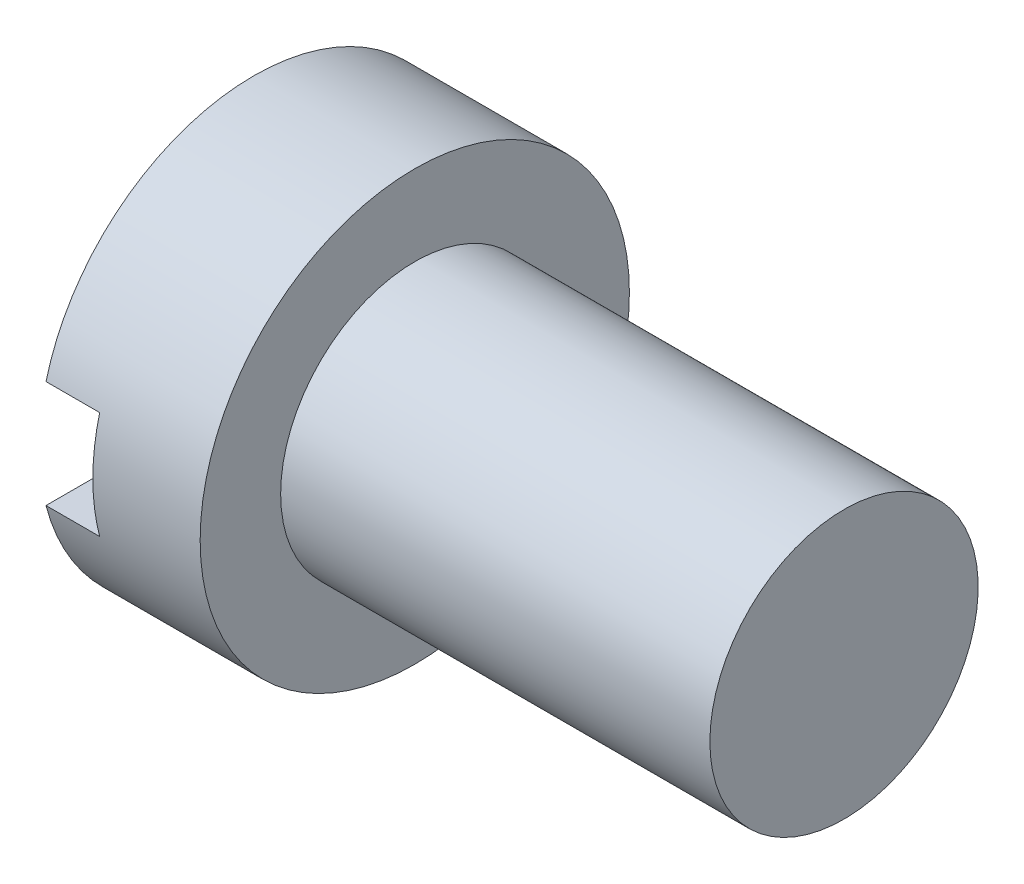
ISO-10303-21;
HEADER;
FILE_DESCRIPTION(('STEP AP214'),'2;1');
FILE_NAME('part.step','',(''),(''),'','','');
FILE_SCHEMA(('AUTOMOTIVE_DESIGN { 1 0 10303 214 1 1 1 1 }'));
ENDSEC;
DATA;
#1=APPLICATION_CONTEXT('core data for automotive mechanical design processes');
#2=APPLICATION_PROTOCOL_DEFINITION('international standard','automotive_design',2000,#1);
#3=PRODUCT_CONTEXT('',#1,'mechanical');
#4=PRODUCT('Part','Part','',(#3));
#5=PRODUCT_RELATED_PRODUCT_CATEGORY('part','',(#4));
#6=PRODUCT_DEFINITION_FORMATION('','',#4);
#7=PRODUCT_DEFINITION_CONTEXT('part definition',#1,'design');
#8=PRODUCT_DEFINITION('design','',#6,#7);
#9=PRODUCT_DEFINITION_SHAPE('','',#8);
#10=(LENGTH_UNIT() NAMED_UNIT(*) SI_UNIT(.MILLI.,.METRE.));
#11=(NAMED_UNIT(*) PLANE_ANGLE_UNIT() SI_UNIT($,.RADIAN.));
#12=(NAMED_UNIT(*) SI_UNIT($,.STERADIAN.) SOLID_ANGLE_UNIT());
#13=UNCERTAINTY_MEASURE_WITH_UNIT(LENGTH_MEASURE(1.E-05),#10,'distance_accuracy_value','');
#14=(GEOMETRIC_REPRESENTATION_CONTEXT(3) GLOBAL_UNCERTAINTY_ASSIGNED_CONTEXT((#13)) GLOBAL_UNIT_ASSIGNED_CONTEXT((#10,
#11,#12)) REPRESENTATION_CONTEXT('',''));
#15=CARTESIAN_POINT('',(0.,0.,0.));
#16=DIRECTION('',(0.,0.,1.));
#17=DIRECTION('',(1.,0.,0.));
#18=AXIS2_PLACEMENT_3D('',#15,#16,#17);
#19=CARTESIAN_POINT('',(0.,0.,0.));
#20=DIRECTION('',(-1.,0.,0.));
#21=DIRECTION('',(0.,0.,1.));
#22=AXIS2_PLACEMENT_3D('',#19,#20,#21);
#23=CYLINDRICAL_SURFACE('',#22,2.);
#24=CARTESIAN_POINT('',(1.5,0.,0.));
#25=DIRECTION('',(-1.,0.,0.));
#26=DIRECTION('',(0.,0.,1.));
#27=AXIS2_PLACEMENT_3D('',#24,#25,#26);
#28=CIRCLE('',#27,2.);
#29=CARTESIAN_POINT('',(1.5,0.,2.));
#30=VERTEX_POINT('',#29);
#31=EDGE_CURVE('E106',#30,#30,#28,.T.);
#32=ORIENTED_EDGE('',*,*,#31,.T.);
#33=EDGE_LOOP('',(#32));
#34=FACE_BOUND('',#33,.T.);
#35=CARTESIAN_POINT('',(0.5,0.,0.));
#36=DIRECTION('',(-1.,0.,0.));
#37=DIRECTION('',(0.,0.,1.));
#38=AXIS2_PLACEMENT_3D('',#35,#36,#37);
#39=CIRCLE('',#38,2.);
#40=CARTESIAN_POINT('',(0.5,0.5,-1.93649167310371));
#41=VERTEX_POINT('',#40);
#42=CARTESIAN_POINT('',(0.5,-0.5,-1.93649167310371));
#43=VERTEX_POINT('',#42);
#44=EDGE_CURVE('E89',#41,#43,#39,.T.);
#45=ORIENTED_EDGE('',*,*,#44,.F.);
#46=DIRECTION('',(-1.,0.,0.));
#47=VECTOR('',#46,1.);
#48=CARTESIAN_POINT('',(0.5,0.5,-1.93649167310371));
#49=LINE('',#48,#47);
#50=CARTESIAN_POINT('',(0.,0.5,-1.93649167310371));
#51=VERTEX_POINT('',#50);
#52=EDGE_CURVE('E79',#41,#51,#49,.T.);
#53=ORIENTED_EDGE('',*,*,#52,.T.);
#54=CARTESIAN_POINT('',(0.,0.,0.));
#55=DIRECTION('',(-1.,0.,0.));
#56=DIRECTION('',(0.,0.,1.));
#57=AXIS2_PLACEMENT_3D('',#54,#55,#56);
#58=CIRCLE('',#57,2.);
#59=CARTESIAN_POINT('',(0.,0.5,1.93649167310371));
#60=VERTEX_POINT('',#59);
#61=EDGE_CURVE('E103',#60,#51,#58,.T.);
#62=ORIENTED_EDGE('',*,*,#61,.F.);
#63=DIRECTION('',(-1.,0.,0.));
#64=VECTOR('',#63,1.);
#65=CARTESIAN_POINT('',(0.5,0.5,1.93649167310371));
#66=LINE('',#65,#64);
#67=CARTESIAN_POINT('',(0.5,0.5,1.93649167310371));
#68=VERTEX_POINT('',#67);
#69=EDGE_CURVE('E75',#68,#60,#66,.T.);
#70=ORIENTED_EDGE('',*,*,#69,.F.);
#71=CARTESIAN_POINT('',(0.5,-0.5,1.93649167310371));
#72=VERTEX_POINT('',#71);
#73=EDGE_CURVE('E88',#72,#68,#39,.T.);
#74=ORIENTED_EDGE('',*,*,#73,.F.);
#75=DIRECTION('',(-1.,0.,0.));
#76=VECTOR('',#75,1.);
#77=CARTESIAN_POINT('',(0.5,-0.5,1.93649167310371));
#78=LINE('',#77,#76);
#79=CARTESIAN_POINT('',(0.,-0.5,1.93649167310371));
#80=VERTEX_POINT('',#79);
#81=EDGE_CURVE('E85',#72,#80,#78,.T.);
#82=ORIENTED_EDGE('',*,*,#81,.T.);
#83=CARTESIAN_POINT('',(0.,-0.5,-1.93649167310371));
#84=VERTEX_POINT('',#83);
#85=EDGE_CURVE('E97',#84,#80,#58,.T.);
#86=ORIENTED_EDGE('',*,*,#85,.F.);
#87=DIRECTION('',(-1.,0.,0.));
#88=VECTOR('',#87,1.);
#89=CARTESIAN_POINT('',(0.5,-0.5,-1.93649167310371));
#90=LINE('',#89,#88);
#91=EDGE_CURVE('E52',#43,#84,#90,.T.);
#92=ORIENTED_EDGE('',*,*,#91,.F.);
#93=EDGE_LOOP('',(#45,#53,#62,#70,#74,#82,#86,#92));
#94=FACE_BOUND('',#93,.T.);
#95=ADVANCED_FACE('F37',(#34,#94),#23,.T.);
#96=CARTESIAN_POINT('',(0.,0.,0.));
#97=DIRECTION('',(-1.,0.,0.));
#98=DIRECTION('',(0.,0.,1.));
#99=AXIS2_PLACEMENT_3D('',#96,#97,#98);
#100=PLANE('',#99);
#101=ORIENTED_EDGE('',*,*,#61,.T.);
#102=DIRECTION('',(0.,0.,1.));
#103=VECTOR('',#102,1.);
#104=CARTESIAN_POINT('',(0.,0.5,0.));
#105=LINE('',#104,#103);
#106=EDGE_CURVE('E195',#51,#60,#105,.T.);
#107=ORIENTED_EDGE('',*,*,#106,.T.);
#108=EDGE_LOOP('',(#101,#107));
#109=FACE_BOUND('',#108,.T.);
#110=ADVANCED_FACE('F123',(#109),#100,.T.);
#111=CARTESIAN_POINT('',(5.5,0.,0.));
#112=DIRECTION('',(-1.,0.,0.));
#113=DIRECTION('',(0.,0.,1.));
#114=AXIS2_PLACEMENT_3D('',#111,#112,#113);
#115=PLANE('',#114);
#116=CARTESIAN_POINT('',(5.5,0.,0.));
#117=DIRECTION('',(-1.,0.,0.));
#118=DIRECTION('',(0.,0.,1.));
#119=AXIS2_PLACEMENT_3D('',#116,#117,#118);
#120=CIRCLE('',#119,1.25);
#121=CARTESIAN_POINT('',(5.5,0.,1.25));
#122=VERTEX_POINT('',#121);
#123=EDGE_CURVE('E11',#122,#122,#120,.T.);
#124=ORIENTED_EDGE('',*,*,#123,.F.);
#125=EDGE_LOOP('',(#124));
#126=FACE_BOUND('',#125,.T.);
#127=ADVANCED_FACE('F39',(#126),#115,.F.);
#128=CARTESIAN_POINT('',(0.,0.,0.));
#129=DIRECTION('',(-1.,0.,0.));
#130=DIRECTION('',(0.,0.,1.));
#131=AXIS2_PLACEMENT_3D('',#128,#129,#130);
#132=CYLINDRICAL_SURFACE('',#131,1.25);
#133=ORIENTED_EDGE('',*,*,#123,.T.);
#134=EDGE_LOOP('',(#133));
#135=FACE_BOUND('',#134,.T.);
#136=CARTESIAN_POINT('',(1.5,0.,0.));
#137=DIRECTION('',(-1.,0.,0.));
#138=DIRECTION('',(0.,0.,1.));
#139=AXIS2_PLACEMENT_3D('',#136,#137,#138);
#140=CIRCLE('',#139,1.25);
#141=CARTESIAN_POINT('',(1.5,0.,1.25));
#142=VERTEX_POINT('',#141);
#143=EDGE_CURVE('E45',#142,#142,#140,.T.);
#144=ORIENTED_EDGE('',*,*,#143,.F.);
#145=EDGE_LOOP('',(#144));
#146=FACE_BOUND('',#145,.T.);
#147=ADVANCED_FACE('F113',(#135,#146),#132,.T.);
#148=CARTESIAN_POINT('',(1.5,0.,0.));
#149=DIRECTION('',(-1.,0.,0.));
#150=DIRECTION('',(0.,0.,1.));
#151=AXIS2_PLACEMENT_3D('',#148,#149,#150);
#152=PLANE('',#151);
#153=ORIENTED_EDGE('',*,*,#31,.F.);
#154=EDGE_LOOP('',(#153));
#155=FACE_BOUND('',#154,.T.);
#156=ORIENTED_EDGE('',*,*,#143,.T.);
#157=EDGE_LOOP('',(#156));
#158=FACE_BOUND('',#157,.T.);
#159=ADVANCED_FACE('F111',(#155,#158),#152,.F.);
#160=DIRECTION('',(0.,0.,1.));
#161=VECTOR('',#160,1.);
#162=CARTESIAN_POINT('',(0.,-0.5,0.));
#163=LINE('',#162,#161);
#164=EDGE_CURVE('E197',#84,#80,#163,.T.);
#165=ORIENTED_EDGE('',*,*,#164,.F.);
#166=ORIENTED_EDGE('',*,*,#85,.T.);
#167=EDGE_LOOP('',(#165,#166));
#168=FACE_BOUND('',#167,.T.);
#169=ADVANCED_FACE('F120',(#168),#100,.T.);
#170=CARTESIAN_POINT('',(0.5,0.5,0.));
#171=DIRECTION('',(0.,-1.,0.));
#172=DIRECTION('',(0.,0.,-1.));
#173=AXIS2_PLACEMENT_3D('',#170,#171,#172);
#174=PLANE('',#173);
#175=ORIENTED_EDGE('',*,*,#106,.F.);
#176=ORIENTED_EDGE('',*,*,#52,.F.);
#177=DIRECTION('',(0.,0.,1.));
#178=VECTOR('',#177,1.);
#179=CARTESIAN_POINT('',(0.5,0.5,0.));
#180=LINE('',#179,#178);
#181=EDGE_CURVE('E61',#41,#68,#180,.T.);
#182=ORIENTED_EDGE('',*,*,#181,.T.);
#183=ORIENTED_EDGE('',*,*,#69,.T.);
#184=EDGE_LOOP('',(#175,#176,#182,#183));
#185=FACE_BOUND('',#184,.T.);
#186=ADVANCED_FACE('F135',(#185),#174,.T.);
#187=CARTESIAN_POINT('',(0.5,-0.5,0.));
#188=DIRECTION('',(0.,-1.,0.));
#189=DIRECTION('',(0.,0.,-1.));
#190=AXIS2_PLACEMENT_3D('',#187,#188,#189);
#191=PLANE('',#190);
#192=ORIENTED_EDGE('',*,*,#164,.T.);
#193=ORIENTED_EDGE('',*,*,#81,.F.);
#194=DIRECTION('',(0.,0.,1.));
#195=VECTOR('',#194,1.);
#196=CARTESIAN_POINT('',(0.5,-0.5,0.));
#197=LINE('',#196,#195);
#198=EDGE_CURVE('E81',#43,#72,#197,.T.);
#199=ORIENTED_EDGE('',*,*,#198,.F.);
#200=ORIENTED_EDGE('',*,*,#91,.T.);
#201=EDGE_LOOP('',(#192,#193,#199,#200));
#202=FACE_BOUND('',#201,.T.);
#203=ADVANCED_FACE('F83',(#202),#191,.F.);
#204=CARTESIAN_POINT('',(0.5,0.,0.));
#205=DIRECTION('',(-1.,0.,0.));
#206=DIRECTION('',(0.,0.,1.));
#207=AXIS2_PLACEMENT_3D('',#204,#205,#206);
#208=PLANE('',#207);
#209=ORIENTED_EDGE('',*,*,#181,.F.);
#210=ORIENTED_EDGE('',*,*,#44,.T.);
#211=ORIENTED_EDGE('',*,*,#198,.T.);
#212=ORIENTED_EDGE('',*,*,#73,.T.);
#213=EDGE_LOOP('',(#209,#210,#211,#212));
#214=FACE_BOUND('',#213,.T.);
#215=ADVANCED_FACE('F92',(#214),#208,.T.);
#216=CLOSED_SHELL('',(#95,#110,#127,#147,#159,#169,#186,#203,#215));
#217=MANIFOLD_SOLID_BREP('B2',#216);
#218=ADVANCED_BREP_SHAPE_REPRESENTATION('',(#18,#217),#14);
#219=SHAPE_DEFINITION_REPRESENTATION(#9,#218);
ENDSEC;
END-ISO-10303-21;
